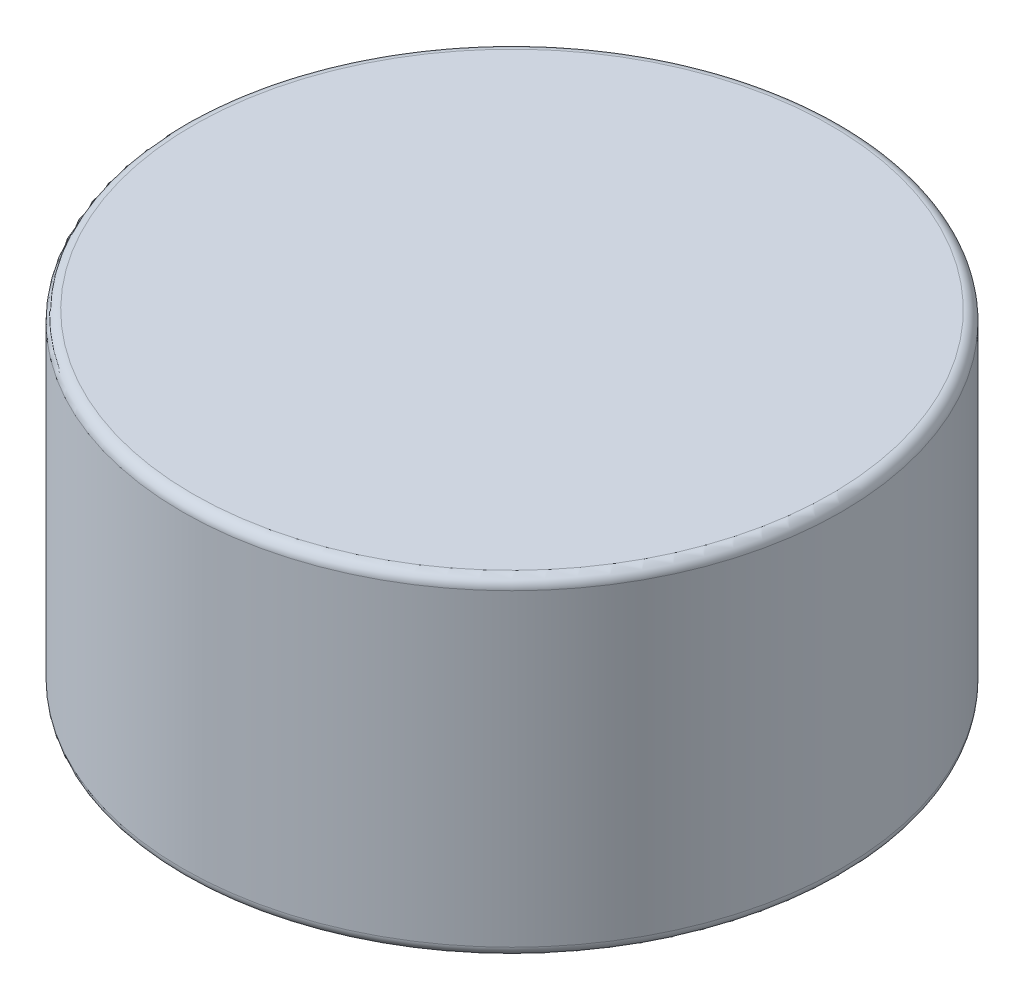
ISO-10303-21;
HEADER;
FILE_DESCRIPTION(('STEP AP214'),'2;1');
FILE_NAME('part.step','',(''),(''),'','','');
FILE_SCHEMA(('AUTOMOTIVE_DESIGN { 1 0 10303 214 1 1 1 1 }'));
ENDSEC;
DATA;
#1=APPLICATION_CONTEXT('core data for automotive mechanical design processes');
#2=APPLICATION_PROTOCOL_DEFINITION('international standard','automotive_design',2000,#1);
#3=PRODUCT_CONTEXT('',#1,'mechanical');
#4=PRODUCT('Part','Part','',(#3));
#5=PRODUCT_RELATED_PRODUCT_CATEGORY('part','',(#4));
#6=PRODUCT_DEFINITION_FORMATION('','',#4);
#7=PRODUCT_DEFINITION_CONTEXT('part definition',#1,'design');
#8=PRODUCT_DEFINITION('design','',#6,#7);
#9=PRODUCT_DEFINITION_SHAPE('','',#8);
#10=(LENGTH_UNIT() NAMED_UNIT(*) SI_UNIT(.MILLI.,.METRE.));
#11=(NAMED_UNIT(*) PLANE_ANGLE_UNIT() SI_UNIT($,.RADIAN.));
#12=(NAMED_UNIT(*) SI_UNIT($,.STERADIAN.) SOLID_ANGLE_UNIT());
#13=UNCERTAINTY_MEASURE_WITH_UNIT(LENGTH_MEASURE(1.E-05),#10,'distance_accuracy_value','');
#14=(GEOMETRIC_REPRESENTATION_CONTEXT(3) GLOBAL_UNCERTAINTY_ASSIGNED_CONTEXT((#13)) GLOBAL_UNIT_ASSIGNED_CONTEXT((#10,
#11,#12)) REPRESENTATION_CONTEXT('',''));
#15=CARTESIAN_POINT('',(0.,0.,0.));
#16=DIRECTION('',(0.,0.,1.));
#17=DIRECTION('',(1.,0.,0.));
#18=AXIS2_PLACEMENT_3D('',#15,#16,#17);
#19=CARTESIAN_POINT('',(0.,3.175,0.));
#20=DIRECTION('',(0.,-1.,0.));
#21=DIRECTION('',(0.,0.,-1.));
#22=AXIS2_PLACEMENT_3D('',#19,#20,#21);
#23=CYLINDRICAL_SURFACE('',#22,3.175);
#24=CARTESIAN_POINT('',(0.,3.075,0.));
#25=DIRECTION('',(0.,1.,0.));
#26=DIRECTION('',(0.,0.,1.));
#27=AXIS2_PLACEMENT_3D('',#24,#25,#26);
#28=CIRCLE('',#27,3.175);
#29=CARTESIAN_POINT('',(0.,3.075,3.175));
#30=VERTEX_POINT('',#29);
#31=EDGE_CURVE('E37',#30,#30,#28,.F.);
#32=ORIENTED_EDGE('',*,*,#31,.T.);
#33=EDGE_LOOP('',(#32));
#34=FACE_BOUND('',#33,.T.);
#35=CARTESIAN_POINT('',(0.,0.0999999999999998,0.));
#36=DIRECTION('',(0.,1.,0.));
#37=DIRECTION('',(0.,0.,1.));
#38=AXIS2_PLACEMENT_3D('',#35,#36,#37);
#39=CIRCLE('',#38,3.175);
#40=CARTESIAN_POINT('',(0.,0.0999999999999998,3.175));
#41=VERTEX_POINT('',#40);
#42=EDGE_CURVE('E41',#41,#41,#39,.T.);
#43=ORIENTED_EDGE('',*,*,#42,.T.);
#44=EDGE_LOOP('',(#43));
#45=FACE_BOUND('',#44,.T.);
#46=ADVANCED_FACE('F30',(#34,#45),#23,.T.);
#47=CARTESIAN_POINT('',(0.,3.175,0.));
#48=DIRECTION('',(0.,1.,0.));
#49=DIRECTION('',(0.,0.,1.));
#50=AXIS2_PLACEMENT_3D('',#47,#48,#49);
#51=PLANE('',#50);
#52=CARTESIAN_POINT('',(0.,3.175,0.));
#53=DIRECTION('',(0.,1.,0.));
#54=DIRECTION('',(0.,0.,1.));
#55=AXIS2_PLACEMENT_3D('',#52,#53,#54);
#56=CIRCLE('',#55,3.075);
#57=CARTESIAN_POINT('',(0.,3.175,3.075));
#58=VERTEX_POINT('',#57);
#59=EDGE_CURVE('E45',#58,#58,#56,.T.);
#60=ORIENTED_EDGE('',*,*,#59,.T.);
#61=EDGE_LOOP('',(#60));
#62=FACE_BOUND('',#61,.T.);
#63=ADVANCED_FACE('F51',(#62),#51,.T.);
#64=CARTESIAN_POINT('',(0.,0.,0.));
#65=DIRECTION('',(0.,1.,0.));
#66=DIRECTION('',(0.,0.,1.));
#67=AXIS2_PLACEMENT_3D('',#64,#65,#66);
#68=PLANE('',#67);
#69=CARTESIAN_POINT('',(0.,0.,0.));
#70=DIRECTION('',(0.,1.,0.));
#71=DIRECTION('',(0.,0.,1.));
#72=AXIS2_PLACEMENT_3D('',#69,#70,#71);
#73=CIRCLE('',#72,3.075);
#74=CARTESIAN_POINT('',(0.,0.,3.075));
#75=VERTEX_POINT('',#74);
#76=EDGE_CURVE('E10',#75,#75,#73,.F.);
#77=ORIENTED_EDGE('',*,*,#76,.T.);
#78=EDGE_LOOP('',(#77));
#79=FACE_BOUND('',#78,.T.);
#80=ADVANCED_FACE('F55',(#79),#68,.F.);
#81=CARTESIAN_POINT('',(0.,3.075,0.));
#82=DIRECTION('',(0.,1.,0.));
#83=DIRECTION('',(0.,0.,1.));
#84=AXIS2_PLACEMENT_3D('',#81,#82,#83);
#85=TOROIDAL_SURFACE('',#84,3.075,0.1);
#86=ORIENTED_EDGE('',*,*,#31,.F.);
#87=EDGE_LOOP('',(#86));
#88=FACE_BOUND('',#87,.T.);
#89=ORIENTED_EDGE('',*,*,#59,.F.);
#90=EDGE_LOOP('',(#89));
#91=FACE_BOUND('',#90,.T.);
#92=ADVANCED_FACE('F53',(#88,#91),#85,.T.);
#93=CARTESIAN_POINT('',(0.,0.0999999999999998,0.));
#94=DIRECTION('',(0.,1.,0.));
#95=DIRECTION('',(0.,0.,1.));
#96=AXIS2_PLACEMENT_3D('',#93,#94,#95);
#97=TOROIDAL_SURFACE('',#96,3.075,0.1);
#98=ORIENTED_EDGE('',*,*,#76,.F.);
#99=EDGE_LOOP('',(#98));
#100=FACE_BOUND('',#99,.T.);
#101=ORIENTED_EDGE('',*,*,#42,.F.);
#102=EDGE_LOOP('',(#101));
#103=FACE_BOUND('',#102,.T.);
#104=ADVANCED_FACE('F32',(#100,#103),#97,.T.);
#105=CLOSED_SHELL('',(#46,#63,#80,#92,#104));
#106=MANIFOLD_SOLID_BREP('B2',#105);
#107=ADVANCED_BREP_SHAPE_REPRESENTATION('',(#18,#106),#14);
#108=SHAPE_DEFINITION_REPRESENTATION(#9,#107);
ENDSEC;
END-ISO-10303-21;
